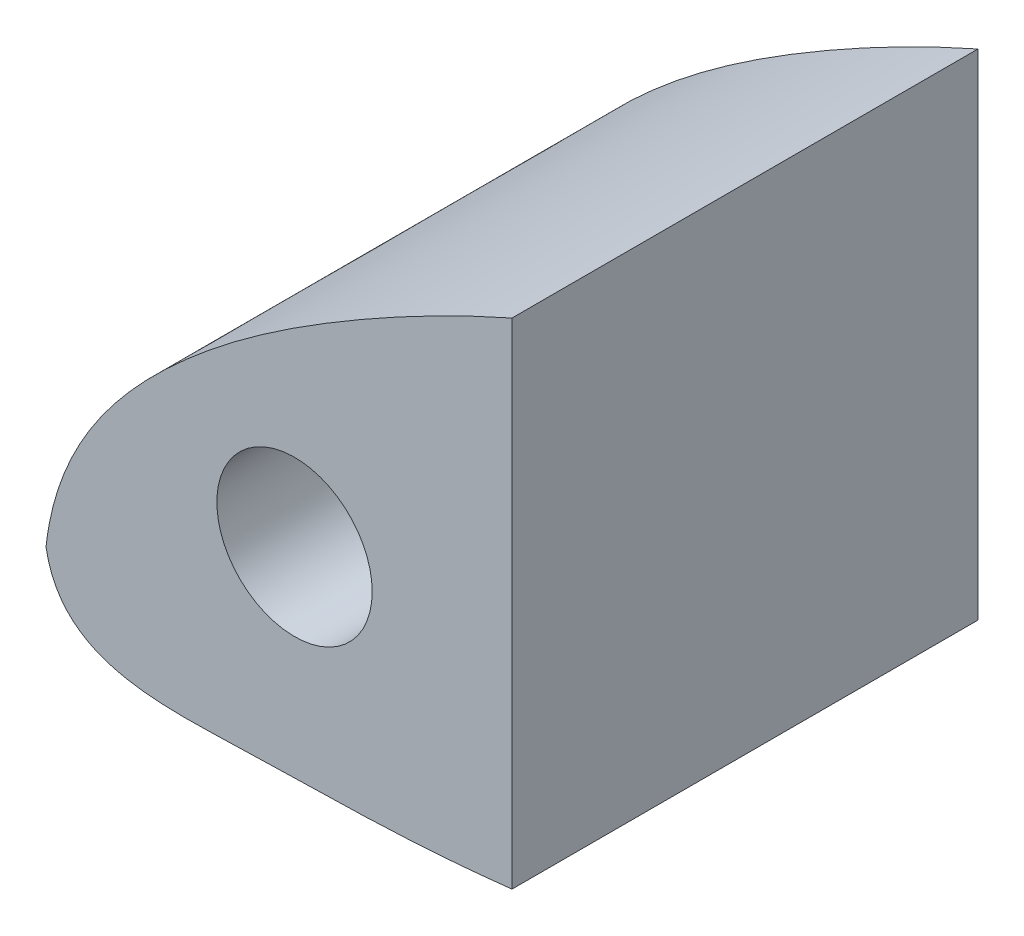
ISO-10303-21;
HEADER;
FILE_DESCRIPTION(('STEP AP214'),'2;1');
FILE_NAME('part.step','',(''),(''),'','','');
FILE_SCHEMA(('AUTOMOTIVE_DESIGN { 1 0 10303 214 1 1 1 1 }'));
ENDSEC;
DATA;
#1=APPLICATION_CONTEXT('core data for automotive mechanical design processes');
#2=APPLICATION_PROTOCOL_DEFINITION('international standard','automotive_design',2000,#1);
#3=PRODUCT_CONTEXT('',#1,'mechanical');
#4=PRODUCT('Part','Part','',(#3));
#5=PRODUCT_RELATED_PRODUCT_CATEGORY('part','',(#4));
#6=PRODUCT_DEFINITION_FORMATION('','',#4);
#7=PRODUCT_DEFINITION_CONTEXT('part definition',#1,'design');
#8=PRODUCT_DEFINITION('design','',#6,#7);
#9=PRODUCT_DEFINITION_SHAPE('','',#8);
#10=(LENGTH_UNIT() NAMED_UNIT(*) SI_UNIT(.MILLI.,.METRE.));
#11=(NAMED_UNIT(*) PLANE_ANGLE_UNIT() SI_UNIT($,.RADIAN.));
#12=(NAMED_UNIT(*) SI_UNIT($,.STERADIAN.) SOLID_ANGLE_UNIT());
#13=UNCERTAINTY_MEASURE_WITH_UNIT(LENGTH_MEASURE(1.E-05),#10,'distance_accuracy_value','');
#14=(GEOMETRIC_REPRESENTATION_CONTEXT(3) GLOBAL_UNCERTAINTY_ASSIGNED_CONTEXT((#13)) GLOBAL_UNIT_ASSIGNED_CONTEXT((#10,
#11,#12)) REPRESENTATION_CONTEXT('',''));
#15=CARTESIAN_POINT('',(0.,0.,0.));
#16=DIRECTION('',(0.,0.,1.));
#17=DIRECTION('',(1.,0.,0.));
#18=AXIS2_PLACEMENT_3D('',#15,#16,#17);
#19=CARTESIAN_POINT('',(0.000560351162113587,0.000130087070423624,38.1));
#20=CARTESIAN_POINT('',(1.23071418869678,-6.92407609127206,38.1));
#21=CARTESIAN_POINT('',(15.3166033306834,-6.18906584099094,38.1));
#22=CARTESIAN_POINT('',(36.4546728163185,-6.09849990105009,38.1));
#23=CARTESIAN_POINT('',(66.5061971849192,-0.586669106973501,38.1));
#24=CARTESIAN_POINT('',(110.497331171581,6.18149522271792,38.1));
#25=CARTESIAN_POINT('',(157.718638091679,9.03065014873911,38.1));
#26=CARTESIAN_POINT('',(205.10142463584,8.83808028186313,38.1));
#27=CARTESIAN_POINT('',(235.858814759408,7.87030619247826,38.1));
#28=CARTESIAN_POINT('',(260.846344817159,5.42741339404395,38.1));
#29=CARTESIAN_POINT('',(276.264022989737,4.51435670375389,38.1));
#30=CARTESIAN_POINT('',(293.989507544058,2.09398731346533,38.1));
#31=CARTESIAN_POINT('',(303.956832564589,1.47095520994628,38.1));
#32=CARTESIAN_POINT('',(309.846313894505,0.000130087070423666,38.1));
#33=B_SPLINE_CURVE_WITH_KNOTS('',3,(#19,#20,#21,#22,#23,#24,#25,#26,#27,#28,#29,#30,#31,#32),
.UNSPECIFIED.,.F.,.F.,(4,1,1,1,1,1,1,1,1,1,1,4),(0.,0.0569078595717698,0.106482711504673,
0.214488052979465,0.341297688349143,0.535095665520157,0.664680853556909,0.794660698192775,
0.828978881532905,0.904725108725214,0.942212919019968,1.),.UNSPECIFIED.);
#34=DIRECTION('',(0.,0.,-1.));
#35=VECTOR('',#34,1.);
#36=SURFACE_OF_LINEAR_EXTRUSION('',#33,#35);
#37=CARTESIAN_POINT('',(0.000560351162113587,0.000130087070423624,0.));
#38=CARTESIAN_POINT('',(1.23071418869678,-6.92407609127206,0.));
#39=CARTESIAN_POINT('',(15.3166033306834,-6.18906584099094,0.));
#40=CARTESIAN_POINT('',(36.4546728163185,-6.09849990105009,0.));
#41=CARTESIAN_POINT('',(66.5061971849192,-0.586669106973501,0.));
#42=CARTESIAN_POINT('',(110.497331171581,6.18149522271792,0.));
#43=CARTESIAN_POINT('',(157.718638091679,9.03065014873911,0.));
#44=CARTESIAN_POINT('',(205.10142463584,8.83808028186313,0.));
#45=CARTESIAN_POINT('',(235.858814759408,7.87030619247826,0.));
#46=CARTESIAN_POINT('',(260.846344817159,5.42741339404395,0.));
#47=CARTESIAN_POINT('',(276.264022989737,4.51435670375389,0.));
#48=CARTESIAN_POINT('',(293.989507544058,2.09398731346533,0.));
#49=CARTESIAN_POINT('',(303.956832564589,1.47095520994628,0.));
#50=CARTESIAN_POINT('',(309.846313894505,0.000130087070423666,0.));
#51=B_SPLINE_CURVE_WITH_KNOTS('',3,(#37,#38,#39,#40,#41,#42,#43,#44,#45,#46,#47,#48,#49,#50),
.UNSPECIFIED.,.F.,.F.,(4,1,1,1,1,1,1,1,1,1,1,4),(0.,0.0569078595717698,0.106482711504673,
0.214488052979465,0.341297688349143,0.535095665520157,0.664680853556909,0.794660698192775,
0.828978881532905,0.904725108725214,0.942212919019968,1.),.UNSPECIFIED.);
#52=CARTESIAN_POINT('',(0.000560351162116727,0.000130087070423829,0.));
#53=VERTEX_POINT('',#52);
#54=CARTESIAN_POINT('',(38.0999999979874,-5.18097252426853,0.));
#55=VERTEX_POINT('',#54);
#56=EDGE_CURVE('E100',#53,#55,#51,.T.);
#57=ORIENTED_EDGE('',*,*,#56,.T.);
#58=DIRECTION('',(0.,0.,-1.));
#59=VECTOR('',#58,1.);
#60=CARTESIAN_POINT('',(38.1,-5.18097252404465,38.1));
#61=LINE('',#60,#59);
#62=CARTESIAN_POINT('',(38.1,-5.18097252426854,38.1));
#63=VERTEX_POINT('',#62);
#64=EDGE_CURVE('E55',#55,#63,#61,.F.);
#65=ORIENTED_EDGE('',*,*,#64,.T.);
#66=CARTESIAN_POINT('',(0.000560351162116727,0.000130087070423829,38.1));
#67=VERTEX_POINT('',#66);
#68=EDGE_CURVE('E84',#67,#63,#33,.T.);
#69=ORIENTED_EDGE('',*,*,#68,.F.);
#70=DIRECTION('',(0.,0.,-1.));
#71=VECTOR('',#70,1.);
#72=CARTESIAN_POINT('',(0.000560351162116727,0.000130087070423829,38.1));
#73=LINE('',#72,#71);
#74=EDGE_CURVE('E11',#67,#53,#73,.T.);
#75=ORIENTED_EDGE('',*,*,#74,.T.);
#76=EDGE_LOOP('',(#57,#65,#69,#75));
#77=FACE_BOUND('',#76,.T.);
#78=ADVANCED_FACE('F39',(#77),#36,.F.);
#79=CARTESIAN_POINT('',(309.846313894505,0.000130087070423864,38.1));
#80=CARTESIAN_POINT('',(314.816918223261,-0.51620674157964,38.1));
#81=CARTESIAN_POINT('',(301.273197720551,4.38282813873556,38.1));
#82=CARTESIAN_POINT('',(290.359837670022,8.71099439045776,38.1));
#83=CARTESIAN_POINT('',(256.952064400645,19.5289209482833,38.1));
#84=CARTESIAN_POINT('',(217.961060472083,29.6129748944238,38.1));
#85=CARTESIAN_POINT('',(173.256699242147,40.0411042779434,38.1));
#86=CARTESIAN_POINT('',(131.400792108858,47.8848319151037,38.1));
#87=CARTESIAN_POINT('',(89.5976184754884,49.290763053775,38.1));
#88=CARTESIAN_POINT('',(52.1111282710831,42.0692152748914,38.1));
#89=CARTESIAN_POINT('',(26.2867198183782,29.9751763284633,38.1));
#90=CARTESIAN_POINT('',(8.64909202481883,17.8566051741579,38.1));
#91=CARTESIAN_POINT('',(0.810633126632263,7.35919605469637,38.1));
#92=CARTESIAN_POINT('',(0.000560351162116727,0.000130087070423829,38.1));
#93=B_SPLINE_CURVE_WITH_KNOTS('',3,(#79,#80,#81,#82,#83,#84,#85,#86,#87,#88,#89,#90,#91,#92),
.UNSPECIFIED.,.F.,.F.,(4,1,1,1,1,1,1,1,1,1,1,4),(0.,0.0239417713693992,0.070244030177139,
0.147561721425381,0.308455887006792,0.442387865106874,0.551517565626309,0.687091076796298,
0.811391258419108,0.886311735305172,0.939136382225768,1.),.UNSPECIFIED.);
#94=DIRECTION('',(0.,0.,-1.));
#95=VECTOR('',#94,1.);
#96=SURFACE_OF_LINEAR_EXTRUSION('',#93,#95);
#97=CARTESIAN_POINT('',(38.1,35.2581330206231,38.1));
#98=VERTEX_POINT('',#97);
#99=EDGE_CURVE('E48',#98,#67,#93,.T.);
#100=ORIENTED_EDGE('',*,*,#99,.F.);
#101=DIRECTION('',(0.,0.,-1.));
#102=VECTOR('',#101,1.);
#103=CARTESIAN_POINT('',(38.1,35.2581330224171,38.1));
#104=LINE('',#103,#102);
#105=CARTESIAN_POINT('',(38.1,35.2581330206231,0.));
#106=VERTEX_POINT('',#105);
#107=EDGE_CURVE('E74',#98,#106,#104,.T.);
#108=ORIENTED_EDGE('',*,*,#107,.T.);
#109=CARTESIAN_POINT('',(309.846313894505,0.000130087070423864,0.));
#110=CARTESIAN_POINT('',(314.816918223261,-0.51620674157964,0.));
#111=CARTESIAN_POINT('',(301.273197720551,4.38282813873556,0.));
#112=CARTESIAN_POINT('',(290.359837670022,8.71099439045776,0.));
#113=CARTESIAN_POINT('',(256.952064400645,19.5289209482833,0.));
#114=CARTESIAN_POINT('',(217.961060472083,29.6129748944238,0.));
#115=CARTESIAN_POINT('',(173.256699242147,40.0411042779434,0.));
#116=CARTESIAN_POINT('',(131.400792108858,47.8848319151037,0.));
#117=CARTESIAN_POINT('',(89.5976184754884,49.290763053775,0.));
#118=CARTESIAN_POINT('',(52.1111282710831,42.0692152748914,0.));
#119=CARTESIAN_POINT('',(26.2867198183782,29.9751763284633,0.));
#120=CARTESIAN_POINT('',(8.64909202481883,17.8566051741579,0.));
#121=CARTESIAN_POINT('',(0.810633126632263,7.35919605469637,0.));
#122=CARTESIAN_POINT('',(0.000560351162116727,0.000130087070423829,0.));
#123=B_SPLINE_CURVE_WITH_KNOTS('',3,(#109,#110,#111,#112,#113,#114,#115,#116,#117,#118,#119,
#120,#121,#122),.UNSPECIFIED.,.F.,.F.,(4,1,1,1,1,1,1,1,1,1,1,4),(0.,0.0239417713693992,
0.070244030177139,0.147561721425381,0.308455887006792,0.442387865106874,0.551517565626309,
0.687091076796298,0.811391258419108,0.886311735305172,0.939136382225768,1.),.UNSPECIFIED.);
#124=EDGE_CURVE('E91',#106,#53,#123,.T.);
#125=ORIENTED_EDGE('',*,*,#124,.T.);
#126=ORIENTED_EDGE('',*,*,#74,.F.);
#127=EDGE_LOOP('',(#100,#108,#125,#126));
#128=FACE_BOUND('',#127,.T.);
#129=ADVANCED_FACE('F87',(#128),#96,.F.);
#130=CARTESIAN_POINT('',(153.387816973495,8.33338198857885,38.1));
#131=DIRECTION('',(0.,0.,-1.));
#132=DIRECTION('',(-1.,0.,0.));
#133=AXIS2_PLACEMENT_3D('',#130,#131,#132);
#134=PLANE('',#133);
#135=CARTESIAN_POINT('',(20.32,10.16,38.1));
#136=DIRECTION('',(0.,0.,1.));
#137=DIRECTION('',(1.,0.,0.));
#138=AXIS2_PLACEMENT_3D('',#135,#136,#137);
#139=CIRCLE('',#138,6.35);
#140=CARTESIAN_POINT('',(26.67,10.16,38.1));
#141=VERTEX_POINT('',#140);
#142=EDGE_CURVE('E133',#141,#141,#139,.T.);
#143=ORIENTED_EDGE('',*,*,#142,.F.);
#144=EDGE_LOOP('',(#143));
#145=FACE_BOUND('',#144,.T.);
#146=ORIENTED_EDGE('',*,*,#68,.T.);
#147=DIRECTION('',(0.,-1.,0.));
#148=VECTOR('',#147,1.);
#149=CARTESIAN_POINT('',(38.1,71.7179988353335,38.1));
#150=LINE('',#149,#148);
#151=EDGE_CURVE('E76',#98,#63,#150,.T.);
#152=ORIENTED_EDGE('',*,*,#151,.F.);
#153=ORIENTED_EDGE('',*,*,#99,.T.);
#154=EDGE_LOOP('',(#146,#152,#153));
#155=FACE_BOUND('',#154,.T.);
#156=ADVANCED_FACE('F82',(#145,#155),#134,.F.);
#157=CARTESIAN_POINT('',(153.387816973495,8.33338198857885,0.));
#158=DIRECTION('',(0.,0.,-1.));
#159=DIRECTION('',(-1.,0.,0.));
#160=AXIS2_PLACEMENT_3D('',#157,#158,#159);
#161=PLANE('',#160);
#162=DIRECTION('',(0.,-1.,0.));
#163=VECTOR('',#162,1.);
#164=CARTESIAN_POINT('',(38.1,71.7179988353335,0.));
#165=LINE('',#164,#163);
#166=EDGE_CURVE('E77',#106,#55,#165,.T.);
#167=ORIENTED_EDGE('',*,*,#166,.T.);
#168=ORIENTED_EDGE('',*,*,#56,.F.);
#169=ORIENTED_EDGE('',*,*,#124,.F.);
#170=EDGE_LOOP('',(#167,#168,#169));
#171=FACE_BOUND('',#170,.T.);
#172=CARTESIAN_POINT('',(20.32,10.16,0.));
#173=DIRECTION('',(0.,0.,1.));
#174=DIRECTION('',(1.,0.,0.));
#175=AXIS2_PLACEMENT_3D('',#172,#173,#174);
#176=CIRCLE('',#175,6.35);
#177=CARTESIAN_POINT('',(26.67,10.16,0.));
#178=VERTEX_POINT('',#177);
#179=EDGE_CURVE('E129',#178,#178,#176,.T.);
#180=ORIENTED_EDGE('',*,*,#179,.T.);
#181=EDGE_LOOP('',(#180));
#182=FACE_BOUND('',#181,.T.);
#183=ADVANCED_FACE('F108',(#171,#182),#161,.T.);
#184=CARTESIAN_POINT('',(20.32,10.16,0.));
#185=DIRECTION('',(0.,0.,1.));
#186=DIRECTION('',(1.,0.,0.));
#187=AXIS2_PLACEMENT_3D('',#184,#185,#186);
#188=CYLINDRICAL_SURFACE('',#187,6.35);
#189=CARTESIAN_POINT('',(26.67,10.16,0.));
#190=CARTESIAN_POINT('',(26.67,10.16,0.396875));
#191=CARTESIAN_POINT('',(26.67,10.16,0.79375));
#192=CARTESIAN_POINT('',(26.67,10.16,1.5875));
#193=CARTESIAN_POINT('',(26.67,10.16,1.984375));
#194=CARTESIAN_POINT('',(26.67,10.16,2.778125));
#195=CARTESIAN_POINT('',(26.67,10.16,3.175));
#196=CARTESIAN_POINT('',(26.67,10.16,3.96875));
#197=CARTESIAN_POINT('',(26.67,10.16,4.365625));
#198=CARTESIAN_POINT('',(26.67,10.16,5.159375));
#199=CARTESIAN_POINT('',(26.67,10.16,5.55625));
#200=CARTESIAN_POINT('',(26.67,10.16,6.35));
#201=CARTESIAN_POINT('',(26.67,10.16,6.746875));
#202=CARTESIAN_POINT('',(26.67,10.16,7.540625));
#203=CARTESIAN_POINT('',(26.67,10.16,7.9375));
#204=CARTESIAN_POINT('',(26.67,10.16,8.73125));
#205=CARTESIAN_POINT('',(26.67,10.16,9.128125));
#206=CARTESIAN_POINT('',(26.67,10.16,9.921875));
#207=CARTESIAN_POINT('',(26.67,10.16,10.31875));
#208=CARTESIAN_POINT('',(26.67,10.16,11.1125));
#209=CARTESIAN_POINT('',(26.67,10.16,11.509375));
#210=CARTESIAN_POINT('',(26.67,10.16,12.303125));
#211=CARTESIAN_POINT('',(26.67,10.16,12.7));
#212=CARTESIAN_POINT('',(26.67,10.16,13.49375));
#213=CARTESIAN_POINT('',(26.67,10.16,13.890625));
#214=CARTESIAN_POINT('',(26.67,10.16,14.684375));
#215=CARTESIAN_POINT('',(26.67,10.16,15.08125));
#216=CARTESIAN_POINT('',(26.67,10.16,15.875));
#217=CARTESIAN_POINT('',(26.67,10.16,16.271875));
#218=CARTESIAN_POINT('',(26.67,10.16,17.065625));
#219=CARTESIAN_POINT('',(26.67,10.16,17.4625));
#220=CARTESIAN_POINT('',(26.67,10.16,18.25625));
#221=CARTESIAN_POINT('',(26.67,10.16,18.653125));
#222=CARTESIAN_POINT('',(26.67,10.16,19.446875));
#223=CARTESIAN_POINT('',(26.67,10.16,19.84375));
#224=CARTESIAN_POINT('',(26.67,10.16,20.6375));
#225=CARTESIAN_POINT('',(26.67,10.16,21.034375));
#226=CARTESIAN_POINT('',(26.67,10.16,21.828125));
#227=CARTESIAN_POINT('',(26.67,10.16,22.225));
#228=CARTESIAN_POINT('',(26.67,10.16,23.01875));
#229=CARTESIAN_POINT('',(26.67,10.16,23.415625));
#230=CARTESIAN_POINT('',(26.67,10.16,24.209375));
#231=CARTESIAN_POINT('',(26.67,10.16,24.60625));
#232=CARTESIAN_POINT('',(26.67,10.16,25.4));
#233=CARTESIAN_POINT('',(26.67,10.16,25.796875));
#234=CARTESIAN_POINT('',(26.67,10.16,26.590625));
#235=CARTESIAN_POINT('',(26.67,10.16,26.9875));
#236=CARTESIAN_POINT('',(26.67,10.16,27.78125));
#237=CARTESIAN_POINT('',(26.67,10.16,28.178125));
#238=CARTESIAN_POINT('',(26.67,10.16,28.971875));
#239=CARTESIAN_POINT('',(26.67,10.16,29.36875));
#240=CARTESIAN_POINT('',(26.67,10.16,30.1625));
#241=CARTESIAN_POINT('',(26.67,10.16,30.559375));
#242=CARTESIAN_POINT('',(26.67,10.16,31.353125));
#243=CARTESIAN_POINT('',(26.67,10.16,31.75));
#244=CARTESIAN_POINT('',(26.67,10.16,32.54375));
#245=CARTESIAN_POINT('',(26.67,10.16,32.940625));
#246=CARTESIAN_POINT('',(26.67,10.16,33.734375));
#247=CARTESIAN_POINT('',(26.67,10.16,34.13125));
#248=CARTESIAN_POINT('',(26.67,10.16,34.925));
#249=CARTESIAN_POINT('',(26.67,10.16,35.321875));
#250=CARTESIAN_POINT('',(26.67,10.16,36.115625));
#251=CARTESIAN_POINT('',(26.67,10.16,36.5125));
#252=CARTESIAN_POINT('',(26.67,10.16,37.30625));
#253=CARTESIAN_POINT('',(26.67,10.16,37.703125));
#254=CARTESIAN_POINT('',(26.67,10.16,38.1));
#255=B_SPLINE_CURVE_WITH_KNOTS('',3,(#189,#190,#191,#192,#193,#194,#195,#196,#197,#198,#199,
#200,#201,#202,#203,#204,#205,#206,#207,#208,#209,#210,#211,#212,#213,#214,#215,#216,#217,#218,
#219,#220,#221,#222,#223,#224,#225,#226,#227,#228,#229,#230,#231,#232,#233,#234,#235,#236,#237,
#238,#239,#240,#241,#242,#243,#244,#245,#246,#247,#248,#249,#250,#251,#252,#253,#254),
.UNSPECIFIED.,.F.,.F.,(4,2,2,2,2,2,2,2,2,2,2,2,2,2,2,2,2,2,2,2,2,2,2,2,2,2,2,2,2,2,2,2,4),(0.,
1.190625,2.38125,3.571875,4.7625,5.953125,7.14375,8.334375,9.525,10.715625,11.90625,13.096875,
14.2875,15.478125,16.66875,17.859375,19.05,20.240625,21.43125,22.621875,23.8125,25.003125,
26.19375,27.384375,28.575,29.765625,30.95625,32.146875,33.3375,34.528125,35.71875,36.909375,
38.1),.UNSPECIFIED.);
#256=EDGE_CURVE('BSEAM111',#178,#141,#255,.T.);
#257=ORIENTED_EDGE('',*,*,#179,.F.);
#258=ORIENTED_EDGE('',*,*,#142,.T.);
#259=ORIENTED_EDGE('',*,*,#256,.T.);
#260=ORIENTED_EDGE('',*,*,#256,.F.);
#261=EDGE_LOOP('',(#257,#259,#258,#260));
#262=FACE_BOUND('',#261,.T.);
#263=ADVANCED_FACE('F111',(#262),#188,.F.);
#264=CARTESIAN_POINT('',(38.1,71.7179988353335,0.));
#265=DIRECTION('',(-1.,0.,0.));
#266=DIRECTION('',(0.,-1.,0.));
#267=AXIS2_PLACEMENT_3D('',#264,#265,#266);
#268=PLANE('',#267);
#269=ORIENTED_EDGE('',*,*,#166,.F.);
#270=ORIENTED_EDGE('',*,*,#107,.F.);
#271=ORIENTED_EDGE('',*,*,#151,.T.);
#272=ORIENTED_EDGE('',*,*,#64,.F.);
#273=EDGE_LOOP('',(#269,#270,#271,#272));
#274=FACE_BOUND('',#273,.T.);
#275=ADVANCED_FACE('F75',(#274),#268,.F.);
#276=CLOSED_SHELL('',(#78,#129,#156,#183,#263,#275));
#277=MANIFOLD_SOLID_BREP('B2',#276);
#278=ADVANCED_BREP_SHAPE_REPRESENTATION('',(#18,#277),#14);
#279=SHAPE_DEFINITION_REPRESENTATION(#9,#278);
ENDSEC;
END-ISO-10303-21;
